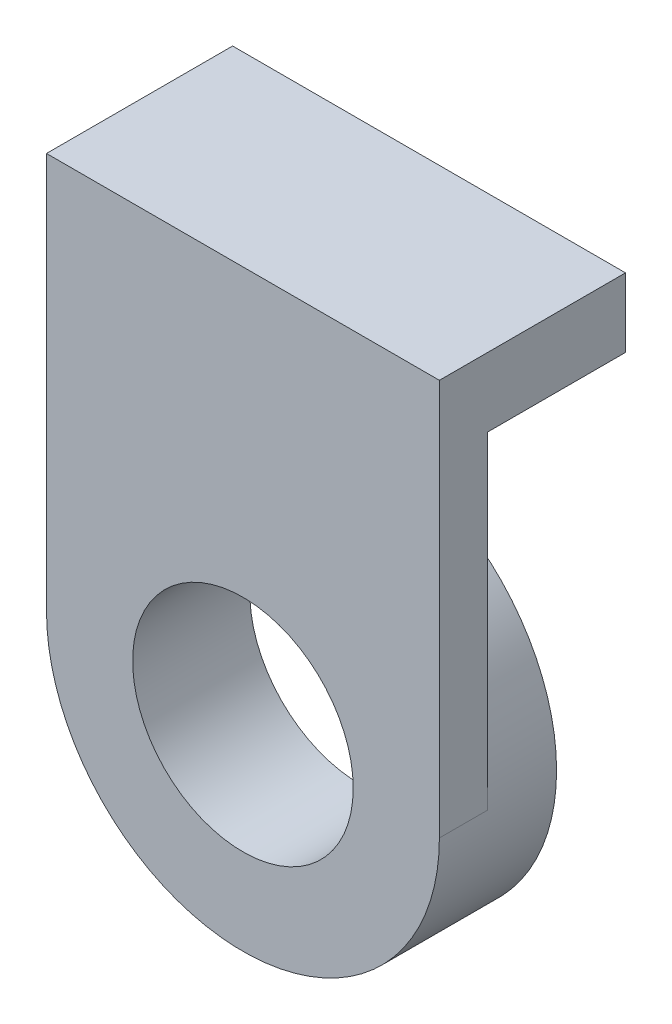
ISO-10303-21;
HEADER;
FILE_DESCRIPTION(('STEP AP214'),'2;1');
FILE_NAME('part.step','',(''),(''),'','','');
FILE_SCHEMA(('AUTOMOTIVE_DESIGN { 1 0 10303 214 1 1 1 1 }'));
ENDSEC;
DATA;
#1=APPLICATION_CONTEXT('core data for automotive mechanical design processes');
#2=APPLICATION_PROTOCOL_DEFINITION('international standard','automotive_design',2000,#1);
#3=PRODUCT_CONTEXT('',#1,'mechanical');
#4=PRODUCT('Part','Part','',(#3));
#5=PRODUCT_RELATED_PRODUCT_CATEGORY('part','',(#4));
#6=PRODUCT_DEFINITION_FORMATION('','',#4);
#7=PRODUCT_DEFINITION_CONTEXT('part definition',#1,'design');
#8=PRODUCT_DEFINITION('design','',#6,#7);
#9=PRODUCT_DEFINITION_SHAPE('','',#8);
#10=(LENGTH_UNIT() NAMED_UNIT(*) SI_UNIT(.MILLI.,.METRE.));
#11=(NAMED_UNIT(*) PLANE_ANGLE_UNIT() SI_UNIT($,.RADIAN.));
#12=(NAMED_UNIT(*) SI_UNIT($,.STERADIAN.) SOLID_ANGLE_UNIT());
#13=UNCERTAINTY_MEASURE_WITH_UNIT(LENGTH_MEASURE(1.E-05),#10,'distance_accuracy_value','');
#14=(GEOMETRIC_REPRESENTATION_CONTEXT(3) GLOBAL_UNCERTAINTY_ASSIGNED_CONTEXT((#13)) GLOBAL_UNIT_ASSIGNED_CONTEXT((#10,
#11,#12)) REPRESENTATION_CONTEXT('',''));
#15=CARTESIAN_POINT('',(0.,0.,0.));
#16=DIRECTION('',(0.,0.,1.));
#17=DIRECTION('',(1.,0.,0.));
#18=AXIS2_PLACEMENT_3D('',#15,#16,#17);
#19=CARTESIAN_POINT('',(0.,0.,1.));
#20=DIRECTION('',(0.,0.,1.));
#21=DIRECTION('',(1.,0.,0.));
#22=AXIS2_PLACEMENT_3D('',#19,#20,#21);
#23=PLANE('',#22);
#24=DIRECTION('',(-1.,0.,0.));
#25=VECTOR('',#24,1.);
#26=CARTESIAN_POINT('',(2.85,4.75,1.));
#27=LINE('',#26,#25);
#28=CARTESIAN_POINT('',(2.85,4.75,1.));
#29=VERTEX_POINT('',#28);
#30=CARTESIAN_POINT('',(-2.85,4.75,1.));
#31=VERTEX_POINT('',#30);
#32=EDGE_CURVE('E59',#29,#31,#27,.T.);
#33=ORIENTED_EDGE('',*,*,#32,.F.);
#34=DIRECTION('',(0.,1.,0.));
#35=VECTOR('',#34,1.);
#36=CARTESIAN_POINT('',(2.85,0.,1.));
#37=LINE('',#36,#35);
#38=CARTESIAN_POINT('',(2.85,0.,1.));
#39=VERTEX_POINT('',#38);
#40=EDGE_CURVE('E115',#39,#29,#37,.T.);
#41=ORIENTED_EDGE('',*,*,#40,.F.);
#42=CARTESIAN_POINT('',(0.,0.,1.));
#43=DIRECTION('',(0.,0.,1.));
#44=DIRECTION('',(1.,0.,0.));
#45=AXIS2_PLACEMENT_3D('',#42,#43,#44);
#46=CIRCLE('',#45,2.85);
#47=CARTESIAN_POINT('',(-2.85,0.,1.));
#48=VERTEX_POINT('',#47);
#49=EDGE_CURVE('E11',#39,#48,#46,.T.);
#50=ORIENTED_EDGE('',*,*,#49,.T.);
#51=DIRECTION('',(0.,1.,0.));
#52=VECTOR('',#51,1.);
#53=CARTESIAN_POINT('',(-2.85,0.,1.));
#54=LINE('',#53,#52);
#55=EDGE_CURVE('E55',#48,#31,#54,.T.);
#56=ORIENTED_EDGE('',*,*,#55,.T.);
#57=EDGE_LOOP('',(#33,#41,#50,#56));
#58=FACE_BOUND('',#57,.T.);
#59=ADVANCED_FACE('F41',(#58),#23,.F.);
#60=CARTESIAN_POINT('',(0.,0.,0.));
#61=DIRECTION('',(0.,0.,1.));
#62=DIRECTION('',(1.,0.,0.));
#63=AXIS2_PLACEMENT_3D('',#60,#61,#62);
#64=PLANE('',#63);
#65=CARTESIAN_POINT('',(0.,0.,0.));
#66=DIRECTION('',(0.,0.,1.));
#67=DIRECTION('',(1.,0.,0.));
#68=AXIS2_PLACEMENT_3D('',#65,#66,#67);
#69=CIRCLE('',#68,2.85);
#70=CARTESIAN_POINT('',(2.85,0.,0.));
#71=VERTEX_POINT('',#70);
#72=EDGE_CURVE('E45',#71,#71,#69,.T.);
#73=ORIENTED_EDGE('',*,*,#72,.F.);
#74=EDGE_LOOP('',(#73));
#75=FACE_BOUND('',#74,.T.);
#76=CARTESIAN_POINT('',(0.,0.,0.));
#77=DIRECTION('',(0.,0.,1.));
#78=DIRECTION('',(1.,0.,0.));
#79=AXIS2_PLACEMENT_3D('',#76,#77,#78);
#80=CIRCLE('',#79,1.6);
#81=CARTESIAN_POINT('',(1.6,0.,0.));
#82=VERTEX_POINT('',#81);
#83=EDGE_CURVE('E144',#82,#82,#80,.T.);
#84=ORIENTED_EDGE('',*,*,#83,.T.);
#85=EDGE_LOOP('',(#84));
#86=FACE_BOUND('',#85,.T.);
#87=ADVANCED_FACE('F152',(#75,#86),#64,.F.);
#88=CARTESIAN_POINT('',(0.,0.,1.));
#89=DIRECTION('',(0.,0.,-1.));
#90=DIRECTION('',(-1.,0.,0.));
#91=AXIS2_PLACEMENT_3D('',#88,#89,#90);
#92=CYLINDRICAL_SURFACE('',#91,2.85);
#93=ORIENTED_EDGE('',*,*,#49,.F.);
#94=DIRECTION('',(0.,0.,-1.));
#95=VECTOR('',#94,1.);
#96=CARTESIAN_POINT('',(2.85,0.,1.7));
#97=LINE('',#96,#95);
#98=CARTESIAN_POINT('',(2.85,0.,1.7));
#99=VERTEX_POINT('',#98);
#100=EDGE_CURVE('E139',#99,#39,#97,.T.);
#101=ORIENTED_EDGE('',*,*,#100,.F.);
#102=CARTESIAN_POINT('',(0.,0.,1.7));
#103=DIRECTION('',(0.,0.,1.));
#104=DIRECTION('',(1.,0.,0.));
#105=AXIS2_PLACEMENT_3D('',#102,#103,#104);
#106=CIRCLE('',#105,2.85);
#107=CARTESIAN_POINT('',(-2.85,0.,1.7));
#108=VERTEX_POINT('',#107);
#109=EDGE_CURVE('E124',#108,#99,#106,.T.);
#110=ORIENTED_EDGE('',*,*,#109,.F.);
#111=DIRECTION('',(0.,0.,-1.));
#112=VECTOR('',#111,1.);
#113=CARTESIAN_POINT('',(-2.85,0.,1.7));
#114=LINE('',#113,#112);
#115=EDGE_CURVE('E141',#108,#48,#114,.T.);
#116=ORIENTED_EDGE('',*,*,#115,.T.);
#117=EDGE_LOOP('',(#93,#101,#110,#116));
#118=FACE_BOUND('',#117,.T.);
#119=ORIENTED_EDGE('',*,*,#72,.T.);
#120=EDGE_LOOP('',(#119));
#121=FACE_BOUND('',#120,.T.);
#122=ADVANCED_FACE('F43',(#118,#121),#92,.T.);
#123=CARTESIAN_POINT('',(0.,0.,1.));
#124=DIRECTION('',(0.,0.,-1.));
#125=DIRECTION('',(-1.,0.,0.));
#126=AXIS2_PLACEMENT_3D('',#123,#124,#125);
#127=CYLINDRICAL_SURFACE('',#126,1.6);
#128=ORIENTED_EDGE('',*,*,#83,.F.);
#129=EDGE_LOOP('',(#128));
#130=FACE_BOUND('',#129,.T.);
#131=CARTESIAN_POINT('',(0.,0.,1.7));
#132=DIRECTION('',(0.,0.,1.));
#133=DIRECTION('',(1.,0.,0.));
#134=AXIS2_PLACEMENT_3D('',#131,#132,#133);
#135=CIRCLE('',#134,1.6);
#136=CARTESIAN_POINT('',(1.6,0.,1.7));
#137=VERTEX_POINT('',#136);
#138=EDGE_CURVE('E131',#137,#137,#135,.F.);
#139=ORIENTED_EDGE('',*,*,#138,.F.);
#140=EDGE_LOOP('',(#139));
#141=FACE_BOUND('',#140,.T.);
#142=ADVANCED_FACE('F157',(#130,#141),#127,.F.);
#143=CARTESIAN_POINT('',(-2.85,0.,1.7));
#144=DIRECTION('',(-1.,0.,0.));
#145=DIRECTION('',(0.,-1.,0.));
#146=AXIS2_PLACEMENT_3D('',#143,#144,#145);
#147=PLANE('',#146);
#148=ORIENTED_EDGE('',*,*,#55,.F.);
#149=ORIENTED_EDGE('',*,*,#115,.F.);
#150=DIRECTION('',(0.,1.,0.));
#151=VECTOR('',#150,1.);
#152=CARTESIAN_POINT('',(-2.85,0.,1.7));
#153=LINE('',#152,#151);
#154=CARTESIAN_POINT('',(-2.85,5.75,1.7));
#155=VERTEX_POINT('',#154);
#156=EDGE_CURVE('E121',#108,#155,#153,.T.);
#157=ORIENTED_EDGE('',*,*,#156,.T.);
#158=DIRECTION('',(0.,0.,-1.));
#159=VECTOR('',#158,1.);
#160=CARTESIAN_POINT('',(-2.85,5.75,1.7));
#161=LINE('',#160,#159);
#162=CARTESIAN_POINT('',(-2.85,5.75,-1.));
#163=VERTEX_POINT('',#162);
#164=EDGE_CURVE('E133',#155,#163,#161,.T.);
#165=ORIENTED_EDGE('',*,*,#164,.T.);
#166=DIRECTION('',(0.,1.,0.));
#167=VECTOR('',#166,1.);
#168=CARTESIAN_POINT('',(-2.85,5.75,-1.));
#169=LINE('',#168,#167);
#170=CARTESIAN_POINT('',(-2.85,4.75,-1.));
#171=VERTEX_POINT('',#170);
#172=EDGE_CURVE('E102',#171,#163,#169,.T.);
#173=ORIENTED_EDGE('',*,*,#172,.F.);
#174=DIRECTION('',(0.,0.,1.));
#175=VECTOR('',#174,1.);
#176=CARTESIAN_POINT('',(-2.85,4.75,-1.));
#177=LINE('',#176,#175);
#178=EDGE_CURVE('E98',#171,#31,#177,.T.);
#179=ORIENTED_EDGE('',*,*,#178,.T.);
#180=EDGE_LOOP('',(#148,#149,#157,#165,#173,#179));
#181=FACE_BOUND('',#180,.T.);
#182=ADVANCED_FACE('F164',(#181),#147,.T.);
#183=CARTESIAN_POINT('',(2.85,0.,1.7));
#184=DIRECTION('',(-1.,0.,0.));
#185=DIRECTION('',(0.,-1.,0.));
#186=AXIS2_PLACEMENT_3D('',#183,#184,#185);
#187=PLANE('',#186);
#188=ORIENTED_EDGE('',*,*,#40,.T.);
#189=DIRECTION('',(0.,0.,1.));
#190=VECTOR('',#189,1.);
#191=CARTESIAN_POINT('',(2.85,4.75,-1.));
#192=LINE('',#191,#190);
#193=CARTESIAN_POINT('',(2.85,4.75,-1.));
#194=VERTEX_POINT('',#193);
#195=EDGE_CURVE('E96',#194,#29,#192,.T.);
#196=ORIENTED_EDGE('',*,*,#195,.F.);
#197=DIRECTION('',(0.,-1.,0.));
#198=VECTOR('',#197,1.);
#199=CARTESIAN_POINT('',(2.85,5.75,-1.));
#200=LINE('',#199,#198);
#201=CARTESIAN_POINT('',(2.85,5.75,-1.));
#202=VERTEX_POINT('',#201);
#203=EDGE_CURVE('E103',#202,#194,#200,.T.);
#204=ORIENTED_EDGE('',*,*,#203,.F.);
#205=DIRECTION('',(0.,0.,-1.));
#206=VECTOR('',#205,1.);
#207=CARTESIAN_POINT('',(2.85,5.75,1.7));
#208=LINE('',#207,#206);
#209=CARTESIAN_POINT('',(2.85,5.75,1.7));
#210=VERTEX_POINT('',#209);
#211=EDGE_CURVE('E137',#210,#202,#208,.T.);
#212=ORIENTED_EDGE('',*,*,#211,.F.);
#213=DIRECTION('',(0.,1.,0.));
#214=VECTOR('',#213,1.);
#215=CARTESIAN_POINT('',(2.85,0.,1.7));
#216=LINE('',#215,#214);
#217=EDGE_CURVE('E126',#99,#210,#216,.T.);
#218=ORIENTED_EDGE('',*,*,#217,.F.);
#219=ORIENTED_EDGE('',*,*,#100,.T.);
#220=EDGE_LOOP('',(#188,#196,#204,#212,#218,#219));
#221=FACE_BOUND('',#220,.T.);
#222=ADVANCED_FACE('F113',(#221),#187,.F.);
#223=CARTESIAN_POINT('',(0.,5.75,1.7));
#224=DIRECTION('',(0.,1.,0.));
#225=DIRECTION('',(0.,0.,1.));
#226=AXIS2_PLACEMENT_3D('',#223,#224,#225);
#227=PLANE('',#226);
#228=ORIENTED_EDGE('',*,*,#211,.T.);
#229=DIRECTION('',(1.,0.,0.));
#230=VECTOR('',#229,1.);
#231=CARTESIAN_POINT('',(2.85,5.75,-1.));
#232=LINE('',#231,#230);
#233=EDGE_CURVE('E109',#163,#202,#232,.T.);
#234=ORIENTED_EDGE('',*,*,#233,.F.);
#235=ORIENTED_EDGE('',*,*,#164,.F.);
#236=DIRECTION('',(1.,0.,0.));
#237=VECTOR('',#236,1.);
#238=CARTESIAN_POINT('',(0.,5.75,1.7));
#239=LINE('',#238,#237);
#240=EDGE_CURVE('E128',#155,#210,#239,.T.);
#241=ORIENTED_EDGE('',*,*,#240,.T.);
#242=EDGE_LOOP('',(#228,#234,#235,#241));
#243=FACE_BOUND('',#242,.T.);
#244=ADVANCED_FACE('F171',(#243),#227,.T.);
#245=CARTESIAN_POINT('',(0.,0.,1.7));
#246=DIRECTION('',(0.,0.,1.));
#247=DIRECTION('',(1.,0.,0.));
#248=AXIS2_PLACEMENT_3D('',#245,#246,#247);
#249=PLANE('',#248);
#250=ORIENTED_EDGE('',*,*,#156,.F.);
#251=ORIENTED_EDGE('',*,*,#109,.T.);
#252=ORIENTED_EDGE('',*,*,#217,.T.);
#253=ORIENTED_EDGE('',*,*,#240,.F.);
#254=EDGE_LOOP('',(#250,#251,#252,#253));
#255=FACE_BOUND('',#254,.T.);
#256=ORIENTED_EDGE('',*,*,#138,.T.);
#257=EDGE_LOOP('',(#256));
#258=FACE_BOUND('',#257,.T.);
#259=ADVANCED_FACE('F173',(#255,#258),#249,.T.);
#260=CARTESIAN_POINT('',(2.85,4.75,-1.));
#261=DIRECTION('',(0.,1.,0.));
#262=DIRECTION('',(0.,0.,1.));
#263=AXIS2_PLACEMENT_3D('',#260,#261,#262);
#264=PLANE('',#263);
#265=ORIENTED_EDGE('',*,*,#32,.T.);
#266=ORIENTED_EDGE('',*,*,#178,.F.);
#267=DIRECTION('',(-1.,0.,0.));
#268=VECTOR('',#267,1.);
#269=CARTESIAN_POINT('',(2.85,4.75,-1.));
#270=LINE('',#269,#268);
#271=EDGE_CURVE('E92',#194,#171,#270,.T.);
#272=ORIENTED_EDGE('',*,*,#271,.F.);
#273=ORIENTED_EDGE('',*,*,#195,.T.);
#274=EDGE_LOOP('',(#265,#266,#272,#273));
#275=FACE_BOUND('',#274,.T.);
#276=ADVANCED_FACE('F94',(#275),#264,.F.);
#277=CARTESIAN_POINT('',(0.,0.,-1.));
#278=DIRECTION('',(0.,0.,-1.));
#279=DIRECTION('',(-1.,0.,0.));
#280=AXIS2_PLACEMENT_3D('',#277,#278,#279);
#281=PLANE('',#280);
#282=ORIENTED_EDGE('',*,*,#203,.T.);
#283=ORIENTED_EDGE('',*,*,#271,.T.);
#284=ORIENTED_EDGE('',*,*,#172,.T.);
#285=ORIENTED_EDGE('',*,*,#233,.T.);
#286=EDGE_LOOP('',(#282,#283,#284,#285));
#287=FACE_BOUND('',#286,.T.);
#288=ADVANCED_FACE('F107',(#287),#281,.T.);
#289=CLOSED_SHELL('',(#59,#87,#122,#142,#182,#222,#244,#259,#276,#288));
#290=MANIFOLD_SOLID_BREP('B2',#289);
#291=ADVANCED_BREP_SHAPE_REPRESENTATION('',(#18,#290),#14);
#292=SHAPE_DEFINITION_REPRESENTATION(#9,#291);
ENDSEC;
END-ISO-10303-21;
